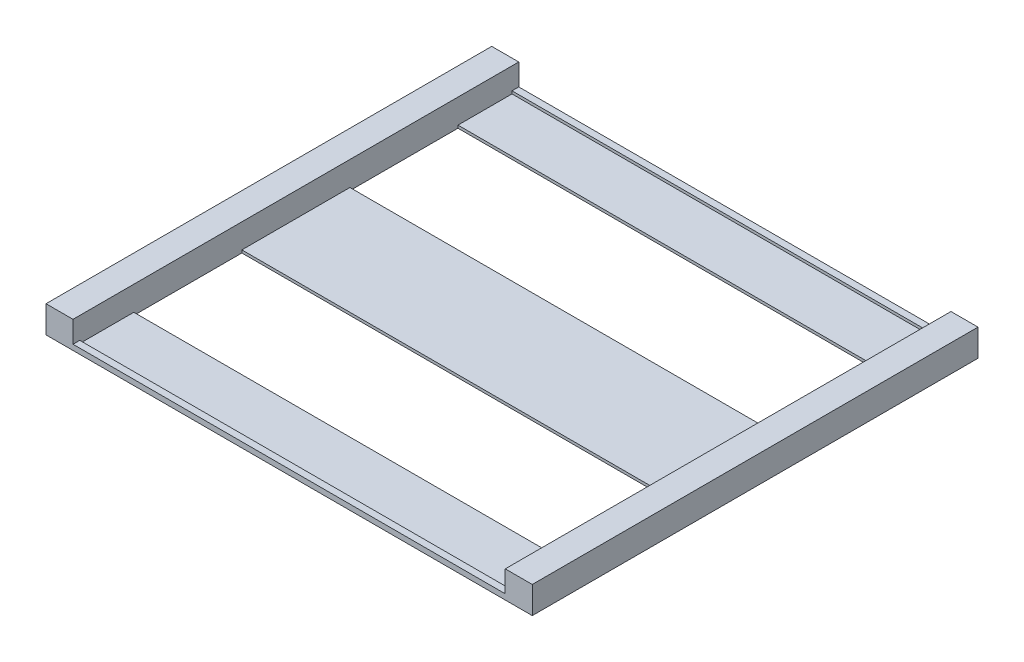
ISO-10303-21;
HEADER;
FILE_DESCRIPTION(('STEP AP214'),'2;1');
FILE_NAME('part.step','',(''),(''),'','','');
FILE_SCHEMA(('AUTOMOTIVE_DESIGN { 1 0 10303 214 1 1 1 1 }'));
ENDSEC;
DATA;
#1=APPLICATION_CONTEXT('core data for automotive mechanical design processes');
#2=APPLICATION_PROTOCOL_DEFINITION('international standard','automotive_design',2000,#1);
#3=PRODUCT_CONTEXT('',#1,'mechanical');
#4=PRODUCT('Part','Part','',(#3));
#5=PRODUCT_RELATED_PRODUCT_CATEGORY('part','',(#4));
#6=PRODUCT_DEFINITION_FORMATION('','',#4);
#7=PRODUCT_DEFINITION_CONTEXT('part definition',#1,'design');
#8=PRODUCT_DEFINITION('design','',#6,#7);
#9=PRODUCT_DEFINITION_SHAPE('','',#8);
#10=(LENGTH_UNIT() NAMED_UNIT(*) SI_UNIT(.MILLI.,.METRE.));
#11=(NAMED_UNIT(*) PLANE_ANGLE_UNIT() SI_UNIT($,.RADIAN.));
#12=(NAMED_UNIT(*) SI_UNIT($,.STERADIAN.) SOLID_ANGLE_UNIT());
#13=UNCERTAINTY_MEASURE_WITH_UNIT(LENGTH_MEASURE(1.E-05),#10,'distance_accuracy_value','');
#14=(GEOMETRIC_REPRESENTATION_CONTEXT(3) GLOBAL_UNCERTAINTY_ASSIGNED_CONTEXT((#13)) GLOBAL_UNIT_ASSIGNED_CONTEXT((#10,
#11,#12)) REPRESENTATION_CONTEXT('',''));
#15=CARTESIAN_POINT('',(0.,0.,0.));
#16=DIRECTION('',(0.,0.,1.));
#17=DIRECTION('',(1.,0.,0.));
#18=AXIS2_PLACEMENT_3D('',#15,#16,#17);
#19=CARTESIAN_POINT('',(80.,1.,-82.5));
#20=DIRECTION('',(1.,0.,0.));
#21=DIRECTION('',(0.,0.,-1.));
#22=AXIS2_PLACEMENT_3D('',#19,#20,#21);
#23=PLANE('',#22);
#24=DIRECTION('',(0.,0.,-1.));
#25=VECTOR('',#24,1.);
#26=CARTESIAN_POINT('',(80.,2.,-82.5));
#27=LINE('',#26,#25);
#28=CARTESIAN_POINT('',(80.,2.,-80.));
#29=VERTEX_POINT('',#28);
#30=CARTESIAN_POINT('',(80.,2.,-82.5));
#31=VERTEX_POINT('',#30);
#32=EDGE_CURVE('E199',#29,#31,#27,.T.);
#33=ORIENTED_EDGE('',*,*,#32,.F.);
#34=DIRECTION('',(0.,-1.,0.));
#35=VECTOR('',#34,1.);
#36=CARTESIAN_POINT('',(80.,2.,-80.));
#37=LINE('',#36,#35);
#38=CARTESIAN_POINT('',(80.,1.,-80.));
#39=VERTEX_POINT('',#38);
#40=EDGE_CURVE('E202',#29,#39,#37,.T.);
#41=ORIENTED_EDGE('',*,*,#40,.T.);
#42=DIRECTION('',(0.,0.,1.));
#43=VECTOR('',#42,1.);
#44=CARTESIAN_POINT('',(80.,1.,-82.5));
#45=LINE('',#44,#43);
#46=CARTESIAN_POINT('',(80.,1.,-60.));
#47=VERTEX_POINT('',#46);
#48=EDGE_CURVE('E377',#39,#47,#45,.T.);
#49=ORIENTED_EDGE('',*,*,#48,.T.);
#50=DIRECTION('',(0.,-1.,0.));
#51=VECTOR('',#50,1.);
#52=CARTESIAN_POINT('',(80.,1.,-60.));
#53=LINE('',#52,#51);
#54=CARTESIAN_POINT('',(80.,0.,-60.));
#55=VERTEX_POINT('',#54);
#56=EDGE_CURVE('E427',#47,#55,#53,.T.);
#57=ORIENTED_EDGE('',*,*,#56,.T.);
#58=DIRECTION('',(0.,0.,1.));
#59=VECTOR('',#58,1.);
#60=CARTESIAN_POINT('',(80.,0.,-82.5));
#61=LINE('',#60,#59);
#62=CARTESIAN_POINT('',(80.,0.,-20.));
#63=VERTEX_POINT('',#62);
#64=EDGE_CURVE('E456',#55,#63,#61,.T.);
#65=ORIENTED_EDGE('',*,*,#64,.T.);
#66=DIRECTION('',(0.,-1.,0.));
#67=VECTOR('',#66,1.);
#68=CARTESIAN_POINT('',(80.,1.,-20.));
#69=LINE('',#68,#67);
#70=CARTESIAN_POINT('',(80.,1.,-20.));
#71=VERTEX_POINT('',#70);
#72=EDGE_CURVE('E422',#71,#63,#69,.T.);
#73=ORIENTED_EDGE('',*,*,#72,.F.);
#74=CARTESIAN_POINT('',(80.,1.,20.));
#75=VERTEX_POINT('',#74);
#76=EDGE_CURVE('E394',#71,#75,#45,.T.);
#77=ORIENTED_EDGE('',*,*,#76,.T.);
#78=DIRECTION('',(0.,-1.,0.));
#79=VECTOR('',#78,1.);
#80=CARTESIAN_POINT('',(80.,1.,20.));
#81=LINE('',#80,#79);
#82=CARTESIAN_POINT('',(80.,0.,20.));
#83=VERTEX_POINT('',#82);
#84=EDGE_CURVE('E404',#75,#83,#81,.T.);
#85=ORIENTED_EDGE('',*,*,#84,.T.);
#86=CARTESIAN_POINT('',(80.,0.,60.));
#87=VERTEX_POINT('',#86);
#88=EDGE_CURVE('E382',#83,#87,#61,.T.);
#89=ORIENTED_EDGE('',*,*,#88,.T.);
#90=DIRECTION('',(0.,-1.,0.));
#91=VECTOR('',#90,1.);
#92=CARTESIAN_POINT('',(80.,1.,60.));
#93=LINE('',#92,#91);
#94=CARTESIAN_POINT('',(80.,1.,60.));
#95=VERTEX_POINT('',#94);
#96=EDGE_CURVE('E443',#95,#87,#93,.T.);
#97=ORIENTED_EDGE('',*,*,#96,.F.);
#98=CARTESIAN_POINT('',(80.,1.,80.));
#99=VERTEX_POINT('',#98);
#100=EDGE_CURVE('E391',#95,#99,#45,.T.);
#101=ORIENTED_EDGE('',*,*,#100,.T.);
#102=DIRECTION('',(0.,-1.,0.));
#103=VECTOR('',#102,1.);
#104=CARTESIAN_POINT('',(80.,2.,80.));
#105=LINE('',#104,#103);
#106=CARTESIAN_POINT('',(80.,2.,80.));
#107=VERTEX_POINT('',#106);
#108=EDGE_CURVE('E365',#107,#99,#105,.T.);
#109=ORIENTED_EDGE('',*,*,#108,.F.);
#110=DIRECTION('',(0.,0.,-1.));
#111=VECTOR('',#110,1.);
#112=CARTESIAN_POINT('',(80.,2.,82.5));
#113=LINE('',#112,#111);
#114=CARTESIAN_POINT('',(80.,2.,82.5));
#115=VERTEX_POINT('',#114);
#116=EDGE_CURVE('E353',#115,#107,#113,.T.);
#117=ORIENTED_EDGE('',*,*,#116,.F.);
#118=DIRECTION('',(0.,-1.,0.));
#119=VECTOR('',#118,1.);
#120=CARTESIAN_POINT('',(80.,10.,82.5));
#121=LINE('',#120,#119);
#122=CARTESIAN_POINT('',(80.,10.,82.5));
#123=VERTEX_POINT('',#122);
#124=EDGE_CURVE('E384',#123,#115,#121,.T.);
#125=ORIENTED_EDGE('',*,*,#124,.F.);
#126=DIRECTION('',(0.,0.,1.));
#127=VECTOR('',#126,1.);
#128=CARTESIAN_POINT('',(80.,10.,-82.5));
#129=LINE('',#128,#127);
#130=CARTESIAN_POINT('',(80.,10.,-82.5));
#131=VERTEX_POINT('',#130);
#132=EDGE_CURVE('E392',#131,#123,#129,.T.);
#133=ORIENTED_EDGE('',*,*,#132,.F.);
#134=DIRECTION('',(0.,-1.,0.));
#135=VECTOR('',#134,1.);
#136=CARTESIAN_POINT('',(80.,10.,-82.5));
#137=LINE('',#136,#135);
#138=EDGE_CURVE('E370',#131,#31,#137,.T.);
#139=ORIENTED_EDGE('',*,*,#138,.T.);
#140=EDGE_LOOP('',(#33,#41,#49,#57,#65,#73,#77,#85,#89,#97,#101,#109,#117,#125,#133,#139));
#141=FACE_BOUND('',#140,.T.);
#142=ADVANCED_FACE('F181',(#141),#23,.F.);
#143=CARTESIAN_POINT('',(0.,1.,0.));
#144=DIRECTION('',(0.,-1.,0.));
#145=DIRECTION('',(0.,0.,-1.));
#146=AXIS2_PLACEMENT_3D('',#143,#144,#145);
#147=PLANE('',#146);
#148=DIRECTION('',(1.,0.,0.));
#149=VECTOR('',#148,1.);
#150=CARTESIAN_POINT('',(-80.,1.,-80.));
#151=LINE('',#150,#149);
#152=CARTESIAN_POINT('',(-80.,1.,-80.));
#153=VERTEX_POINT('',#152);
#154=EDGE_CURVE('E343',#153,#39,#151,.T.);
#155=ORIENTED_EDGE('',*,*,#154,.F.);
#156=DIRECTION('',(0.,0.,-1.));
#157=VECTOR('',#156,1.);
#158=CARTESIAN_POINT('',(-80.,1.,-82.5));
#159=LINE('',#158,#157);
#160=CARTESIAN_POINT('',(-80.,1.,-60.));
#161=VERTEX_POINT('',#160);
#162=EDGE_CURVE('E193',#161,#153,#159,.T.);
#163=ORIENTED_EDGE('',*,*,#162,.F.);
#164=DIRECTION('',(1.,0.,0.));
#165=VECTOR('',#164,1.);
#166=CARTESIAN_POINT('',(-80.,1.,-60.));
#167=LINE('',#166,#165);
#168=EDGE_CURVE('E438',#161,#47,#167,.T.);
#169=ORIENTED_EDGE('',*,*,#168,.T.);
#170=ORIENTED_EDGE('',*,*,#48,.F.);
#171=EDGE_LOOP('',(#155,#163,#169,#170));
#172=FACE_BOUND('',#171,.T.);
#173=ADVANCED_FACE('F538',(#172),#147,.F.);
#174=DIRECTION('',(-1.,0.,0.));
#175=VECTOR('',#174,1.);
#176=CARTESIAN_POINT('',(-80.,1.,80.));
#177=LINE('',#176,#175);
#178=CARTESIAN_POINT('',(-80.,1.,80.));
#179=VERTEX_POINT('',#178);
#180=EDGE_CURVE('E332',#99,#179,#177,.T.);
#181=ORIENTED_EDGE('',*,*,#180,.F.);
#182=ORIENTED_EDGE('',*,*,#100,.F.);
#183=DIRECTION('',(1.,0.,0.));
#184=VECTOR('',#183,1.);
#185=CARTESIAN_POINT('',(-80.,1.,60.));
#186=LINE('',#185,#184);
#187=CARTESIAN_POINT('',(-80.,1.,60.));
#188=VERTEX_POINT('',#187);
#189=EDGE_CURVE('E450',#188,#95,#186,.T.);
#190=ORIENTED_EDGE('',*,*,#189,.F.);
#191=EDGE_CURVE('E191',#179,#188,#159,.T.);
#192=ORIENTED_EDGE('',*,*,#191,.F.);
#193=EDGE_LOOP('',(#181,#182,#190,#192));
#194=FACE_BOUND('',#193,.T.);
#195=ADVANCED_FACE('F501',(#194),#147,.F.);
#196=CARTESIAN_POINT('',(-80.,1.,20.));
#197=VERTEX_POINT('',#196);
#198=CARTESIAN_POINT('',(-80.,1.,-20.));
#199=VERTEX_POINT('',#198);
#200=EDGE_CURVE('E12',#197,#199,#159,.T.);
#201=ORIENTED_EDGE('',*,*,#200,.F.);
#202=DIRECTION('',(1.,0.,0.));
#203=VECTOR('',#202,1.);
#204=CARTESIAN_POINT('',(-80.,1.,20.));
#205=LINE('',#204,#203);
#206=EDGE_CURVE('E416',#197,#75,#205,.T.);
#207=ORIENTED_EDGE('',*,*,#206,.T.);
#208=ORIENTED_EDGE('',*,*,#76,.F.);
#209=DIRECTION('',(1.,0.,0.));
#210=VECTOR('',#209,1.);
#211=CARTESIAN_POINT('',(-80.,1.,-20.));
#212=LINE('',#211,#210);
#213=EDGE_CURVE('E423',#199,#71,#212,.T.);
#214=ORIENTED_EDGE('',*,*,#213,.F.);
#215=EDGE_LOOP('',(#201,#207,#208,#214));
#216=FACE_BOUND('',#215,.T.);
#217=ADVANCED_FACE('F518',(#216),#147,.F.);
#218=CARTESIAN_POINT('',(-90.,1.,-82.5));
#219=DIRECTION('',(0.,0.,-1.));
#220=DIRECTION('',(-1.,0.,0.));
#221=AXIS2_PLACEMENT_3D('',#218,#219,#220);
#222=PLANE('',#221);
#223=DIRECTION('',(-1.,0.,0.));
#224=VECTOR('',#223,1.);
#225=CARTESIAN_POINT('',(-80.,2.,-82.5));
#226=LINE('',#225,#224);
#227=CARTESIAN_POINT('',(-80.,2.,-82.5));
#228=VERTEX_POINT('',#227);
#229=EDGE_CURVE('E337',#31,#228,#226,.T.);
#230=ORIENTED_EDGE('',*,*,#229,.F.);
#231=ORIENTED_EDGE('',*,*,#138,.F.);
#232=DIRECTION('',(-1.,0.,0.));
#233=VECTOR('',#232,1.);
#234=CARTESIAN_POINT('',(90.,10.,-82.5));
#235=LINE('',#234,#233);
#236=CARTESIAN_POINT('',(90.,10.,-82.5));
#237=VERTEX_POINT('',#236);
#238=EDGE_CURVE('E400',#237,#131,#235,.T.);
#239=ORIENTED_EDGE('',*,*,#238,.F.);
#240=DIRECTION('',(0.,-1.,0.));
#241=VECTOR('',#240,1.);
#242=CARTESIAN_POINT('',(90.,1.,-82.5));
#243=LINE('',#242,#241);
#244=CARTESIAN_POINT('',(90.,0.,-82.5));
#245=VERTEX_POINT('',#244);
#246=EDGE_CURVE('E189',#237,#245,#243,.T.);
#247=ORIENTED_EDGE('',*,*,#246,.T.);
#248=DIRECTION('',(1.,0.,0.));
#249=VECTOR('',#248,1.);
#250=CARTESIAN_POINT('',(-90.,0.,-82.5));
#251=LINE('',#250,#249);
#252=CARTESIAN_POINT('',(-90.,0.,-82.5));
#253=VERTEX_POINT('',#252);
#254=EDGE_CURVE('E410',#253,#245,#251,.T.);
#255=ORIENTED_EDGE('',*,*,#254,.F.);
#256=DIRECTION('',(0.,-1.,0.));
#257=VECTOR('',#256,1.);
#258=CARTESIAN_POINT('',(-90.,1.,-82.5));
#259=LINE('',#258,#257);
#260=CARTESIAN_POINT('',(-90.,10.,-82.5));
#261=VERTEX_POINT('',#260);
#262=EDGE_CURVE('E414',#261,#253,#259,.T.);
#263=ORIENTED_EDGE('',*,*,#262,.F.);
#264=DIRECTION('',(-1.,0.,0.));
#265=VECTOR('',#264,1.);
#266=CARTESIAN_POINT('',(-90.,10.,-82.5));
#267=LINE('',#266,#265);
#268=CARTESIAN_POINT('',(-80.,10.,-82.5));
#269=VERTEX_POINT('',#268);
#270=EDGE_CURVE('E374',#269,#261,#267,.T.);
#271=ORIENTED_EDGE('',*,*,#270,.F.);
#272=DIRECTION('',(0.,-1.,0.));
#273=VECTOR('',#272,1.);
#274=CARTESIAN_POINT('',(-80.,10.,-82.5));
#275=LINE('',#274,#273);
#276=EDGE_CURVE('E380',#269,#228,#275,.T.);
#277=ORIENTED_EDGE('',*,*,#276,.T.);
#278=EDGE_LOOP('',(#230,#231,#239,#247,#255,#263,#271,#277));
#279=FACE_BOUND('',#278,.T.);
#280=ADVANCED_FACE('F473',(#279),#222,.T.);
#281=CARTESIAN_POINT('',(-90.,1.,-82.5));
#282=DIRECTION('',(1.,0.,0.));
#283=DIRECTION('',(0.,0.,-1.));
#284=AXIS2_PLACEMENT_3D('',#281,#282,#283);
#285=PLANE('',#284);
#286=DIRECTION('',(0.,0.,1.));
#287=VECTOR('',#286,1.);
#288=CARTESIAN_POINT('',(-90.,0.,-82.5));
#289=LINE('',#288,#287);
#290=CARTESIAN_POINT('',(-90.,0.,82.5));
#291=VERTEX_POINT('',#290);
#292=EDGE_CURVE('E407',#253,#291,#289,.T.);
#293=ORIENTED_EDGE('',*,*,#292,.T.);
#294=DIRECTION('',(0.,-1.,0.));
#295=VECTOR('',#294,1.);
#296=CARTESIAN_POINT('',(-90.,1.,82.5));
#297=LINE('',#296,#295);
#298=CARTESIAN_POINT('',(-90.,10.,82.5));
#299=VERTEX_POINT('',#298);
#300=EDGE_CURVE('E415',#299,#291,#297,.T.);
#301=ORIENTED_EDGE('',*,*,#300,.F.);
#302=DIRECTION('',(0.,0.,1.));
#303=VECTOR('',#302,1.);
#304=CARTESIAN_POINT('',(-90.,10.,-82.5));
#305=LINE('',#304,#303);
#306=EDGE_CURVE('E366',#261,#299,#305,.T.);
#307=ORIENTED_EDGE('',*,*,#306,.F.);
#308=ORIENTED_EDGE('',*,*,#262,.T.);
#309=EDGE_LOOP('',(#293,#301,#307,#308));
#310=FACE_BOUND('',#309,.T.);
#311=ADVANCED_FACE('F479',(#310),#285,.F.);
#312=CARTESIAN_POINT('',(0.,0.,0.));
#313=DIRECTION('',(0.,-1.,0.));
#314=DIRECTION('',(0.,0.,-1.));
#315=AXIS2_PLACEMENT_3D('',#312,#313,#314);
#316=PLANE('',#315);
#317=DIRECTION('',(1.,0.,0.));
#318=VECTOR('',#317,1.);
#319=CARTESIAN_POINT('',(-80.,0.,60.));
#320=LINE('',#319,#318);
#321=CARTESIAN_POINT('',(-80.,0.,60.));
#322=VERTEX_POINT('',#321);
#323=EDGE_CURVE('E453',#322,#87,#320,.T.);
#324=ORIENTED_EDGE('',*,*,#323,.T.);
#325=ORIENTED_EDGE('',*,*,#88,.F.);
#326=DIRECTION('',(1.,0.,0.));
#327=VECTOR('',#326,1.);
#328=CARTESIAN_POINT('',(-80.,0.,20.));
#329=LINE('',#328,#327);
#330=CARTESIAN_POINT('',(-80.,0.,20.));
#331=VERTEX_POINT('',#330);
#332=EDGE_CURVE('E426',#331,#83,#329,.T.);
#333=ORIENTED_EDGE('',*,*,#332,.F.);
#334=DIRECTION('',(0.,0.,1.));
#335=VECTOR('',#334,1.);
#336=CARTESIAN_POINT('',(-80.,0.,-82.5));
#337=LINE('',#336,#335);
#338=EDGE_CURVE('E401',#331,#322,#337,.T.);
#339=ORIENTED_EDGE('',*,*,#338,.T.);
#340=EDGE_LOOP('',(#324,#325,#333,#339));
#341=FACE_BOUND('',#340,.T.);
#342=ORIENTED_EDGE('',*,*,#64,.F.);
#343=DIRECTION('',(1.,0.,0.));
#344=VECTOR('',#343,1.);
#345=CARTESIAN_POINT('',(-80.,0.,-60.));
#346=LINE('',#345,#344);
#347=CARTESIAN_POINT('',(-80.,0.,-60.));
#348=VERTEX_POINT('',#347);
#349=EDGE_CURVE('E445',#348,#55,#346,.T.);
#350=ORIENTED_EDGE('',*,*,#349,.F.);
#351=CARTESIAN_POINT('',(-80.,0.,-20.));
#352=VERTEX_POINT('',#351);
#353=EDGE_CURVE('E406',#348,#352,#337,.T.);
#354=ORIENTED_EDGE('',*,*,#353,.T.);
#355=DIRECTION('',(1.,0.,0.));
#356=VECTOR('',#355,1.);
#357=CARTESIAN_POINT('',(-80.,0.,-20.));
#358=LINE('',#357,#356);
#359=EDGE_CURVE('E425',#352,#63,#358,.T.);
#360=ORIENTED_EDGE('',*,*,#359,.T.);
#361=EDGE_LOOP('',(#342,#350,#354,#360));
#362=FACE_BOUND('',#361,.T.);
#363=DIRECTION('',(1.,0.,0.));
#364=VECTOR('',#363,1.);
#365=CARTESIAN_POINT('',(-90.,0.,82.5));
#366=LINE('',#365,#364);
#367=CARTESIAN_POINT('',(90.,0.,82.5));
#368=VERTEX_POINT('',#367);
#369=EDGE_CURVE('E402',#291,#368,#366,.T.);
#370=ORIENTED_EDGE('',*,*,#369,.F.);
#371=ORIENTED_EDGE('',*,*,#292,.F.);
#372=ORIENTED_EDGE('',*,*,#254,.T.);
#373=DIRECTION('',(0.,0.,1.));
#374=VECTOR('',#373,1.);
#375=CARTESIAN_POINT('',(90.,0.,-82.5));
#376=LINE('',#375,#374);
#377=EDGE_CURVE('E464',#245,#368,#376,.T.);
#378=ORIENTED_EDGE('',*,*,#377,.T.);
#379=EDGE_LOOP('',(#370,#371,#372,#378));
#380=FACE_BOUND('',#379,.T.);
#381=ADVANCED_FACE('F478',(#341,#362,#380),#316,.T.);
#382=CARTESIAN_POINT('',(-80.,1.,-82.5));
#383=DIRECTION('',(1.,0.,0.));
#384=DIRECTION('',(0.,0.,-1.));
#385=AXIS2_PLACEMENT_3D('',#382,#383,#384);
#386=PLANE('',#385);
#387=DIRECTION('',(0.,-1.,0.));
#388=VECTOR('',#387,1.);
#389=CARTESIAN_POINT('',(-80.,2.,-80.));
#390=LINE('',#389,#388);
#391=CARTESIAN_POINT('',(-80.,2.,-80.));
#392=VERTEX_POINT('',#391);
#393=EDGE_CURVE('E321',#392,#153,#390,.T.);
#394=ORIENTED_EDGE('',*,*,#393,.F.);
#395=DIRECTION('',(0.,0.,1.));
#396=VECTOR('',#395,1.);
#397=CARTESIAN_POINT('',(-80.,2.,-82.5));
#398=LINE('',#397,#396);
#399=EDGE_CURVE('E326',#228,#392,#398,.T.);
#400=ORIENTED_EDGE('',*,*,#399,.F.);
#401=ORIENTED_EDGE('',*,*,#276,.F.);
#402=DIRECTION('',(0.,0.,-1.));
#403=VECTOR('',#402,1.);
#404=CARTESIAN_POINT('',(-80.,10.,-82.5));
#405=LINE('',#404,#403);
#406=CARTESIAN_POINT('',(-80.,10.,82.5));
#407=VERTEX_POINT('',#406);
#408=EDGE_CURVE('E373',#407,#269,#405,.T.);
#409=ORIENTED_EDGE('',*,*,#408,.F.);
#410=DIRECTION('',(0.,-1.,0.));
#411=VECTOR('',#410,1.);
#412=CARTESIAN_POINT('',(-80.,10.,82.5));
#413=LINE('',#412,#411);
#414=CARTESIAN_POINT('',(-80.,2.,82.5));
#415=VERTEX_POINT('',#414);
#416=EDGE_CURVE('E381',#407,#415,#413,.T.);
#417=ORIENTED_EDGE('',*,*,#416,.T.);
#418=DIRECTION('',(0.,0.,1.));
#419=VECTOR('',#418,1.);
#420=CARTESIAN_POINT('',(-80.,2.,82.5));
#421=LINE('',#420,#419);
#422=CARTESIAN_POINT('',(-80.,2.,80.));
#423=VERTEX_POINT('',#422);
#424=EDGE_CURVE('E346',#423,#415,#421,.T.);
#425=ORIENTED_EDGE('',*,*,#424,.F.);
#426=DIRECTION('',(0.,-1.,0.));
#427=VECTOR('',#426,1.);
#428=CARTESIAN_POINT('',(-80.,2.,80.));
#429=LINE('',#428,#427);
#430=EDGE_CURVE('E359',#423,#179,#429,.T.);
#431=ORIENTED_EDGE('',*,*,#430,.T.);
#432=ORIENTED_EDGE('',*,*,#191,.T.);
#433=DIRECTION('',(0.,-1.,0.));
#434=VECTOR('',#433,1.);
#435=CARTESIAN_POINT('',(-80.,1.,60.));
#436=LINE('',#435,#434);
#437=EDGE_CURVE('E417',#188,#322,#436,.T.);
#438=ORIENTED_EDGE('',*,*,#437,.T.);
#439=ORIENTED_EDGE('',*,*,#338,.F.);
#440=DIRECTION('',(0.,-1.,0.));
#441=VECTOR('',#440,1.);
#442=CARTESIAN_POINT('',(-80.,1.,20.));
#443=LINE('',#442,#441);
#444=EDGE_CURVE('E435',#197,#331,#443,.T.);
#445=ORIENTED_EDGE('',*,*,#444,.F.);
#446=ORIENTED_EDGE('',*,*,#200,.T.);
#447=DIRECTION('',(0.,-1.,0.));
#448=VECTOR('',#447,1.);
#449=CARTESIAN_POINT('',(-80.,1.,-20.));
#450=LINE('',#449,#448);
#451=EDGE_CURVE('E432',#199,#352,#450,.T.);
#452=ORIENTED_EDGE('',*,*,#451,.T.);
#453=ORIENTED_EDGE('',*,*,#353,.F.);
#454=DIRECTION('',(0.,-1.,0.));
#455=VECTOR('',#454,1.);
#456=CARTESIAN_POINT('',(-80.,1.,-60.));
#457=LINE('',#456,#455);
#458=EDGE_CURVE('E436',#161,#348,#457,.T.);
#459=ORIENTED_EDGE('',*,*,#458,.F.);
#460=ORIENTED_EDGE('',*,*,#162,.T.);
#461=EDGE_LOOP('',(#394,#400,#401,#409,#417,#425,#431,#432,#438,#439,#445,#446,#452,#453,#459,#460));
#462=FACE_BOUND('',#461,.T.);
#463=ADVANCED_FACE('F323',(#462),#386,.T.);
#464=CARTESIAN_POINT('',(-90.,1.,82.5));
#465=DIRECTION('',(0.,0.,-1.));
#466=DIRECTION('',(-1.,0.,0.));
#467=AXIS2_PLACEMENT_3D('',#464,#465,#466);
#468=PLANE('',#467);
#469=ORIENTED_EDGE('',*,*,#369,.T.);
#470=DIRECTION('',(0.,-1.,0.));
#471=VECTOR('',#470,1.);
#472=CARTESIAN_POINT('',(90.,1.,82.5));
#473=LINE('',#472,#471);
#474=CARTESIAN_POINT('',(90.,10.,82.5));
#475=VERTEX_POINT('',#474);
#476=EDGE_CURVE('E452',#475,#368,#473,.T.);
#477=ORIENTED_EDGE('',*,*,#476,.F.);
#478=DIRECTION('',(1.,0.,0.));
#479=VECTOR('',#478,1.);
#480=CARTESIAN_POINT('',(90.,10.,82.5));
#481=LINE('',#480,#479);
#482=EDGE_CURVE('E389',#123,#475,#481,.T.);
#483=ORIENTED_EDGE('',*,*,#482,.F.);
#484=ORIENTED_EDGE('',*,*,#124,.T.);
#485=DIRECTION('',(1.,0.,0.));
#486=VECTOR('',#485,1.);
#487=CARTESIAN_POINT('',(-80.,2.,82.5));
#488=LINE('',#487,#486);
#489=EDGE_CURVE('E354',#415,#115,#488,.T.);
#490=ORIENTED_EDGE('',*,*,#489,.F.);
#491=ORIENTED_EDGE('',*,*,#416,.F.);
#492=DIRECTION('',(1.,0.,0.));
#493=VECTOR('',#492,1.);
#494=CARTESIAN_POINT('',(-90.,10.,82.5));
#495=LINE('',#494,#493);
#496=EDGE_CURVE('E371',#299,#407,#495,.T.);
#497=ORIENTED_EDGE('',*,*,#496,.F.);
#498=ORIENTED_EDGE('',*,*,#300,.T.);
#499=EDGE_LOOP('',(#469,#477,#483,#484,#490,#491,#497,#498));
#500=FACE_BOUND('',#499,.T.);
#501=ADVANCED_FACE('F483',(#500),#468,.F.);
#502=CARTESIAN_POINT('',(90.,1.,-82.5));
#503=DIRECTION('',(1.,0.,0.));
#504=DIRECTION('',(0.,0.,-1.));
#505=AXIS2_PLACEMENT_3D('',#502,#503,#504);
#506=PLANE('',#505);
#507=ORIENTED_EDGE('',*,*,#377,.F.);
#508=ORIENTED_EDGE('',*,*,#246,.F.);
#509=DIRECTION('',(0.,0.,-1.));
#510=VECTOR('',#509,1.);
#511=CARTESIAN_POINT('',(90.,10.,-82.5));
#512=LINE('',#511,#510);
#513=EDGE_CURVE('E388',#475,#237,#512,.T.);
#514=ORIENTED_EDGE('',*,*,#513,.F.);
#515=ORIENTED_EDGE('',*,*,#476,.T.);
#516=EDGE_LOOP('',(#507,#508,#514,#515));
#517=FACE_BOUND('',#516,.T.);
#518=ADVANCED_FACE('F471',(#517),#506,.T.);
#519=CARTESIAN_POINT('',(-80.,1.,60.));
#520=DIRECTION('',(0.,0.,-1.));
#521=DIRECTION('',(-1.,0.,0.));
#522=AXIS2_PLACEMENT_3D('',#519,#520,#521);
#523=PLANE('',#522);
#524=ORIENTED_EDGE('',*,*,#323,.F.);
#525=ORIENTED_EDGE('',*,*,#437,.F.);
#526=ORIENTED_EDGE('',*,*,#189,.T.);
#527=ORIENTED_EDGE('',*,*,#96,.T.);
#528=EDGE_LOOP('',(#524,#525,#526,#527));
#529=FACE_BOUND('',#528,.T.);
#530=ADVANCED_FACE('F510',(#529),#523,.T.);
#531=CARTESIAN_POINT('',(-80.,1.,-60.));
#532=DIRECTION('',(0.,0.,-1.));
#533=DIRECTION('',(-1.,0.,0.));
#534=AXIS2_PLACEMENT_3D('',#531,#532,#533);
#535=PLANE('',#534);
#536=ORIENTED_EDGE('',*,*,#349,.T.);
#537=ORIENTED_EDGE('',*,*,#56,.F.);
#538=ORIENTED_EDGE('',*,*,#168,.F.);
#539=ORIENTED_EDGE('',*,*,#458,.T.);
#540=EDGE_LOOP('',(#536,#537,#538,#539));
#541=FACE_BOUND('',#540,.T.);
#542=ADVANCED_FACE('F534',(#541),#535,.F.);
#543=CARTESIAN_POINT('',(-80.,1.,-20.));
#544=DIRECTION('',(0.,0.,-1.));
#545=DIRECTION('',(-1.,0.,0.));
#546=AXIS2_PLACEMENT_3D('',#543,#544,#545);
#547=PLANE('',#546);
#548=ORIENTED_EDGE('',*,*,#359,.F.);
#549=ORIENTED_EDGE('',*,*,#451,.F.);
#550=ORIENTED_EDGE('',*,*,#213,.T.);
#551=ORIENTED_EDGE('',*,*,#72,.T.);
#552=EDGE_LOOP('',(#548,#549,#550,#551));
#553=FACE_BOUND('',#552,.T.);
#554=ADVANCED_FACE('F535',(#553),#547,.T.);
#555=CARTESIAN_POINT('',(-80.,1.,20.));
#556=DIRECTION('',(0.,0.,-1.));
#557=DIRECTION('',(-1.,0.,0.));
#558=AXIS2_PLACEMENT_3D('',#555,#556,#557);
#559=PLANE('',#558);
#560=ORIENTED_EDGE('',*,*,#332,.T.);
#561=ORIENTED_EDGE('',*,*,#84,.F.);
#562=ORIENTED_EDGE('',*,*,#206,.F.);
#563=ORIENTED_EDGE('',*,*,#444,.T.);
#564=EDGE_LOOP('',(#560,#561,#562,#563));
#565=FACE_BOUND('',#564,.T.);
#566=ADVANCED_FACE('F519',(#565),#559,.F.);
#567=CARTESIAN_POINT('',(0.,10.,0.));
#568=DIRECTION('',(0.,-1.,0.));
#569=DIRECTION('',(0.,0.,-1.));
#570=AXIS2_PLACEMENT_3D('',#567,#568,#569);
#571=PLANE('',#570);
#572=ORIENTED_EDGE('',*,*,#513,.T.);
#573=ORIENTED_EDGE('',*,*,#238,.T.);
#574=ORIENTED_EDGE('',*,*,#132,.T.);
#575=ORIENTED_EDGE('',*,*,#482,.T.);
#576=EDGE_LOOP('',(#572,#573,#574,#575));
#577=FACE_BOUND('',#576,.T.);
#578=ADVANCED_FACE('F522',(#577),#571,.F.);
#579=CARTESIAN_POINT('',(0.,10.,0.));
#580=DIRECTION('',(0.,1.,0.));
#581=DIRECTION('',(0.,0.,1.));
#582=AXIS2_PLACEMENT_3D('',#579,#580,#581);
#583=PLANE('',#582);
#584=ORIENTED_EDGE('',*,*,#306,.T.);
#585=ORIENTED_EDGE('',*,*,#496,.T.);
#586=ORIENTED_EDGE('',*,*,#408,.T.);
#587=ORIENTED_EDGE('',*,*,#270,.T.);
#588=EDGE_LOOP('',(#584,#585,#586,#587));
#589=FACE_BOUND('',#588,.T.);
#590=ADVANCED_FACE('F488',(#589),#583,.T.);
#591=CARTESIAN_POINT('',(-80.,2.,80.));
#592=DIRECTION('',(0.,0.,1.));
#593=DIRECTION('',(1.,0.,0.));
#594=AXIS2_PLACEMENT_3D('',#591,#592,#593);
#595=PLANE('',#594);
#596=ORIENTED_EDGE('',*,*,#180,.T.);
#597=ORIENTED_EDGE('',*,*,#430,.F.);
#598=DIRECTION('',(-1.,0.,0.));
#599=VECTOR('',#598,1.);
#600=CARTESIAN_POINT('',(-80.,2.,80.));
#601=LINE('',#600,#599);
#602=EDGE_CURVE('E360',#107,#423,#601,.T.);
#603=ORIENTED_EDGE('',*,*,#602,.F.);
#604=ORIENTED_EDGE('',*,*,#108,.T.);
#605=EDGE_LOOP('',(#596,#597,#603,#604));
#606=FACE_BOUND('',#605,.T.);
#607=ADVANCED_FACE('F500',(#606),#595,.F.);
#608=CARTESIAN_POINT('',(0.,2.,0.));
#609=DIRECTION('',(0.,-1.,0.));
#610=DIRECTION('',(0.,0.,-1.));
#611=AXIS2_PLACEMENT_3D('',#608,#609,#610);
#612=PLANE('',#611);
#613=ORIENTED_EDGE('',*,*,#424,.T.);
#614=ORIENTED_EDGE('',*,*,#489,.T.);
#615=ORIENTED_EDGE('',*,*,#116,.T.);
#616=ORIENTED_EDGE('',*,*,#602,.T.);
#617=EDGE_LOOP('',(#613,#614,#615,#616));
#618=FACE_BOUND('',#617,.T.);
#619=ADVANCED_FACE('F492',(#618),#612,.F.);
#620=CARTESIAN_POINT('',(-80.,2.,-80.));
#621=DIRECTION('',(0.,0.,-1.));
#622=DIRECTION('',(-1.,0.,0.));
#623=AXIS2_PLACEMENT_3D('',#620,#621,#622);
#624=PLANE('',#623);
#625=ORIENTED_EDGE('',*,*,#154,.T.);
#626=ORIENTED_EDGE('',*,*,#40,.F.);
#627=DIRECTION('',(1.,0.,0.));
#628=VECTOR('',#627,1.);
#629=CARTESIAN_POINT('',(-80.,2.,-80.));
#630=LINE('',#629,#628);
#631=EDGE_CURVE('E334',#392,#29,#630,.T.);
#632=ORIENTED_EDGE('',*,*,#631,.F.);
#633=ORIENTED_EDGE('',*,*,#393,.T.);
#634=EDGE_LOOP('',(#625,#626,#632,#633));
#635=FACE_BOUND('',#634,.T.);
#636=ADVANCED_FACE('F331',(#635),#624,.F.);
#637=CARTESIAN_POINT('',(0.,2.,0.));
#638=DIRECTION('',(0.,1.,0.));
#639=DIRECTION('',(0.,0.,1.));
#640=AXIS2_PLACEMENT_3D('',#637,#638,#639);
#641=PLANE('',#640);
#642=ORIENTED_EDGE('',*,*,#399,.T.);
#643=ORIENTED_EDGE('',*,*,#631,.T.);
#644=ORIENTED_EDGE('',*,*,#32,.T.);
#645=ORIENTED_EDGE('',*,*,#229,.T.);
#646=EDGE_LOOP('',(#642,#643,#644,#645));
#647=FACE_BOUND('',#646,.T.);
#648=ADVANCED_FACE('F340',(#647),#641,.T.);
#649=CLOSED_SHELL('',(#142,#173,#195,#217,#280,#311,#381,#463,#501,#518,#530,#542,#554,#566,
#578,#590,#607,#619,#636,#648));
#650=MANIFOLD_SOLID_BREP('B2',#649);
#651=ADVANCED_BREP_SHAPE_REPRESENTATION('',(#18,#650),#14);
#652=SHAPE_DEFINITION_REPRESENTATION(#9,#651);
ENDSEC;
END-ISO-10303-21;
